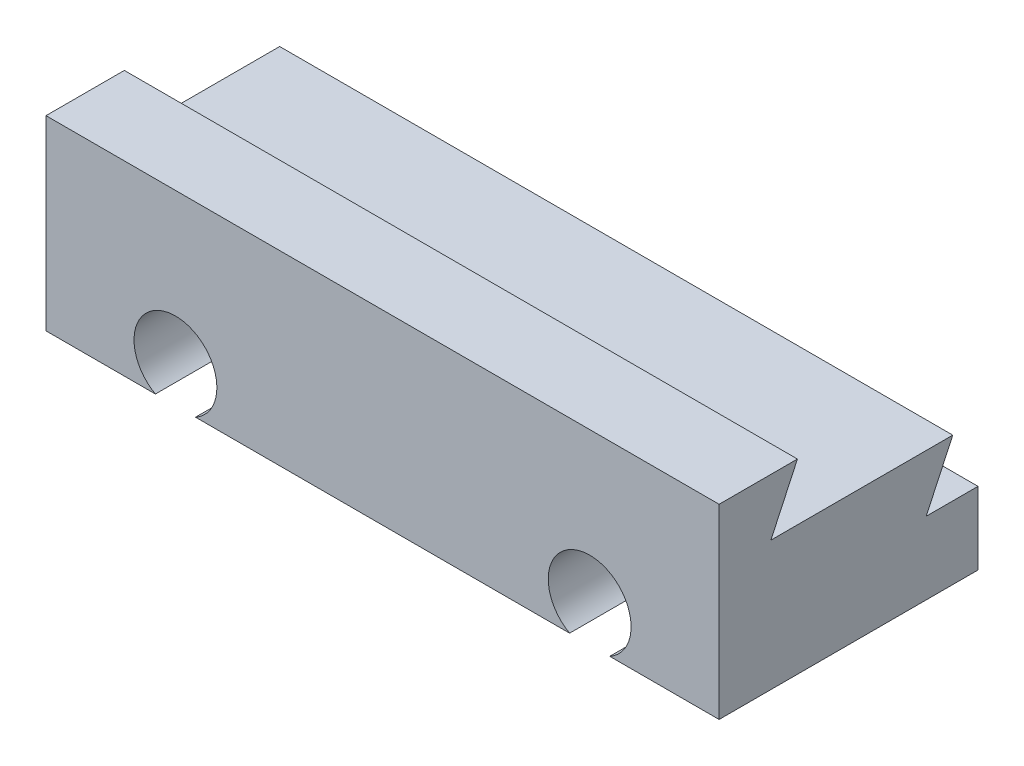
ISO-10303-21;
HEADER;
FILE_DESCRIPTION(('STEP AP214'),'2;1');
FILE_NAME('part.step','',(''),(''),'','','');
FILE_SCHEMA(('AUTOMOTIVE_DESIGN { 1 0 10303 214 1 1 1 1 }'));
ENDSEC;
DATA;
#1=APPLICATION_CONTEXT('core data for automotive mechanical design processes');
#2=APPLICATION_PROTOCOL_DEFINITION('international standard','automotive_design',2000,#1);
#3=PRODUCT_CONTEXT('',#1,'mechanical');
#4=PRODUCT('Part','Part','',(#3));
#5=PRODUCT_RELATED_PRODUCT_CATEGORY('part','',(#4));
#6=PRODUCT_DEFINITION_FORMATION('','',#4);
#7=PRODUCT_DEFINITION_CONTEXT('part definition',#1,'design');
#8=PRODUCT_DEFINITION('design','',#6,#7);
#9=PRODUCT_DEFINITION_SHAPE('','',#8);
#10=(LENGTH_UNIT() NAMED_UNIT(*) SI_UNIT(.MILLI.,.METRE.));
#11=(NAMED_UNIT(*) PLANE_ANGLE_UNIT() SI_UNIT($,.RADIAN.));
#12=(NAMED_UNIT(*) SI_UNIT($,.STERADIAN.) SOLID_ANGLE_UNIT());
#13=UNCERTAINTY_MEASURE_WITH_UNIT(LENGTH_MEASURE(1.E-05),#10,'distance_accuracy_value','');
#14=(GEOMETRIC_REPRESENTATION_CONTEXT(3) GLOBAL_UNCERTAINTY_ASSIGNED_CONTEXT((#13)) GLOBAL_UNIT_ASSIGNED_CONTEXT((#10,
#11,#12)) REPRESENTATION_CONTEXT('',''));
#15=CARTESIAN_POINT('',(0.,0.,0.));
#16=DIRECTION('',(0.,0.,1.));
#17=DIRECTION('',(1.,0.,0.));
#18=AXIS2_PLACEMENT_3D('',#15,#16,#17);
#19=CARTESIAN_POINT('',(52.5,3.5,5.939696961967));
#20=DIRECTION('',(0.,0.,-1.));
#21=DIRECTION('',(-1.,0.,0.));
#22=AXIS2_PLACEMENT_3D('',#19,#20,#21);
#23=CYLINDRICAL_SURFACE('',#22,2.1);
#24=CARTESIAN_POINT('',(52.5,3.5,-25.));
#25=DIRECTION('',(0.,0.,-1.));
#26=DIRECTION('',(1.,0.,0.));
#27=AXIS2_PLACEMENT_3D('',#24,#25,#26);
#28=CIRCLE('',#27,2.1);
#29=CARTESIAN_POINT('',(54.6,3.5,-25.));
#30=VERTEX_POINT('',#29);
#31=EDGE_CURVE('E144',#30,#30,#28,.T.);
#32=ORIENTED_EDGE('',*,*,#31,.T.);
#33=EDGE_LOOP('',(#32));
#34=FACE_BOUND('',#33,.T.);
#35=CARTESIAN_POINT('',(52.5,3.5,-15.));
#36=DIRECTION('',(0.,0.,1.));
#37=DIRECTION('',(1.,0.,0.));
#38=AXIS2_PLACEMENT_3D('',#35,#36,#37);
#39=CIRCLE('',#38,2.1);
#40=CARTESIAN_POINT('',(54.6,3.5,-15.));
#41=VERTEX_POINT('',#40);
#42=EDGE_CURVE('E38',#41,#41,#39,.F.);
#43=ORIENTED_EDGE('',*,*,#42,.F.);
#44=EDGE_LOOP('',(#43));
#45=FACE_BOUND('',#44,.T.);
#46=ADVANCED_FACE('F34',(#34,#45),#23,.F.);
#47=CARTESIAN_POINT('',(12.5,3.5,5.939696961967));
#48=DIRECTION('',(0.,0.,-1.));
#49=DIRECTION('',(-1.,0.,0.));
#50=AXIS2_PLACEMENT_3D('',#47,#48,#49);
#51=CYLINDRICAL_SURFACE('',#50,2.1);
#52=CARTESIAN_POINT('',(12.5,3.5,-25.));
#53=DIRECTION('',(0.,0.,-1.));
#54=DIRECTION('',(-1.,0.,0.));
#55=AXIS2_PLACEMENT_3D('',#52,#53,#54);
#56=CIRCLE('',#55,2.1);
#57=CARTESIAN_POINT('',(10.4,3.5,-25.));
#58=VERTEX_POINT('',#57);
#59=EDGE_CURVE('E149',#58,#58,#56,.T.);
#60=ORIENTED_EDGE('',*,*,#59,.T.);
#61=EDGE_LOOP('',(#60));
#62=FACE_BOUND('',#61,.T.);
#63=CARTESIAN_POINT('',(12.5,3.5,-15.));
#64=DIRECTION('',(0.,0.,1.));
#65=DIRECTION('',(1.,0.,0.));
#66=AXIS2_PLACEMENT_3D('',#63,#64,#65);
#67=CIRCLE('',#66,2.1);
#68=CARTESIAN_POINT('',(14.6,3.5,-15.));
#69=VERTEX_POINT('',#68);
#70=EDGE_CURVE('E132',#69,#69,#67,.F.);
#71=ORIENTED_EDGE('',*,*,#70,.F.);
#72=EDGE_LOOP('',(#71));
#73=FACE_BOUND('',#72,.T.);
#74=ADVANCED_FACE('F213',(#62,#73),#51,.F.);
#75=CARTESIAN_POINT('',(65.,0.,-25.));
#76=DIRECTION('',(0.,1.,0.));
#77=DIRECTION('',(0.,0.,1.));
#78=AXIS2_PLACEMENT_3D('',#75,#76,#77);
#79=PLANE('',#78);
#80=DIRECTION('',(1.,0.,0.));
#81=VECTOR('',#80,1.);
#82=CARTESIAN_POINT('',(65.,0.,-15.));
#83=LINE('',#82,#81);
#84=CARTESIAN_POINT('',(10.5635083268963,0.,-15.));
#85=VERTEX_POINT('',#84);
#86=CARTESIAN_POINT('',(14.4364916731037,0.,-15.));
#87=VERTEX_POINT('',#86);
#88=EDGE_CURVE('E127',#85,#87,#83,.T.);
#89=ORIENTED_EDGE('',*,*,#88,.F.);
#90=DIRECTION('',(0.,0.,1.));
#91=VECTOR('',#90,1.);
#92=CARTESIAN_POINT('',(10.5635083268963,0.,-36.3137084989848));
#93=LINE('',#92,#91);
#94=CARTESIAN_POINT('',(10.5635083268963,0.,0.));
#95=VERTEX_POINT('',#94);
#96=EDGE_CURVE('E135',#85,#95,#93,.T.);
#97=ORIENTED_EDGE('',*,*,#96,.T.);
#98=DIRECTION('',(-1.,0.,0.));
#99=VECTOR('',#98,1.);
#100=CARTESIAN_POINT('',(65.,0.,0.));
#101=LINE('',#100,#99);
#102=CARTESIAN_POINT('',(0.,0.,0.));
#103=VERTEX_POINT('',#102);
#104=EDGE_CURVE('E173',#95,#103,#101,.T.);
#105=ORIENTED_EDGE('',*,*,#104,.T.);
#106=DIRECTION('',(0.,0.,-1.));
#107=VECTOR('',#106,1.);
#108=CARTESIAN_POINT('',(0.,0.,-25.));
#109=LINE('',#108,#107);
#110=CARTESIAN_POINT('',(0.,0.,-25.));
#111=VERTEX_POINT('',#110);
#112=EDGE_CURVE('E152',#103,#111,#109,.T.);
#113=ORIENTED_EDGE('',*,*,#112,.T.);
#114=DIRECTION('',(-1.,0.,0.));
#115=VECTOR('',#114,1.);
#116=CARTESIAN_POINT('',(65.,0.,-25.));
#117=LINE('',#116,#115);
#118=CARTESIAN_POINT('',(65.,0.,-25.));
#119=VERTEX_POINT('',#118);
#120=EDGE_CURVE('E12',#119,#111,#117,.T.);
#121=ORIENTED_EDGE('',*,*,#120,.F.);
#122=DIRECTION('',(0.,0.,-1.));
#123=VECTOR('',#122,1.);
#124=CARTESIAN_POINT('',(65.,0.,-25.));
#125=LINE('',#124,#123);
#126=CARTESIAN_POINT('',(65.,0.,0.));
#127=VERTEX_POINT('',#126);
#128=EDGE_CURVE('E155',#127,#119,#125,.T.);
#129=ORIENTED_EDGE('',*,*,#128,.F.);
#130=CARTESIAN_POINT('',(54.4364916731037,0.,0.));
#131=VERTEX_POINT('',#130);
#132=EDGE_CURVE('E190',#127,#131,#101,.T.);
#133=ORIENTED_EDGE('',*,*,#132,.T.);
#134=DIRECTION('',(0.,0.,1.));
#135=VECTOR('',#134,1.);
#136=CARTESIAN_POINT('',(54.4364916731037,0.,-36.3137084989848));
#137=LINE('',#136,#135);
#138=CARTESIAN_POINT('',(54.4364916731037,0.,-15.));
#139=VERTEX_POINT('',#138);
#140=EDGE_CURVE('E59',#131,#139,#137,.F.);
#141=ORIENTED_EDGE('',*,*,#140,.T.);
#142=DIRECTION('',(1.,0.,0.));
#143=VECTOR('',#142,1.);
#144=CARTESIAN_POINT('',(65.,0.,-15.));
#145=LINE('',#144,#143);
#146=CARTESIAN_POINT('',(50.5635083268963,0.,-15.));
#147=VERTEX_POINT('',#146);
#148=EDGE_CURVE('E292',#147,#139,#145,.T.);
#149=ORIENTED_EDGE('',*,*,#148,.F.);
#150=DIRECTION('',(0.,0.,1.));
#151=VECTOR('',#150,1.);
#152=CARTESIAN_POINT('',(50.5635083268963,0.,-36.3137084989848));
#153=LINE('',#152,#151);
#154=CARTESIAN_POINT('',(50.5635083268963,0.,0.));
#155=VERTEX_POINT('',#154);
#156=EDGE_CURVE('E142',#147,#155,#153,.T.);
#157=ORIENTED_EDGE('',*,*,#156,.T.);
#158=CARTESIAN_POINT('',(14.4364916731037,0.,0.));
#159=VERTEX_POINT('',#158);
#160=EDGE_CURVE('E141',#155,#159,#101,.T.);
#161=ORIENTED_EDGE('',*,*,#160,.T.);
#162=DIRECTION('',(0.,0.,1.));
#163=VECTOR('',#162,1.);
#164=CARTESIAN_POINT('',(14.4364916731037,0.,-36.3137084989848));
#165=LINE('',#164,#163);
#166=EDGE_CURVE('E51',#159,#87,#165,.F.);
#167=ORIENTED_EDGE('',*,*,#166,.T.);
#168=EDGE_LOOP('',(#89,#97,#105,#113,#121,#129,#133,#141,#149,#157,#161,#167));
#169=FACE_BOUND('',#168,.T.);
#170=ADVANCED_FACE('F36',(#169),#79,.F.);
#171=CARTESIAN_POINT('',(65.,7.,-25.));
#172=DIRECTION('',(0.,0.,1.));
#173=DIRECTION('',(1.,0.,0.));
#174=AXIS2_PLACEMENT_3D('',#171,#172,#173);
#175=PLANE('',#174);
#176=ORIENTED_EDGE('',*,*,#59,.F.);
#177=EDGE_LOOP('',(#176));
#178=FACE_BOUND('',#177,.T.);
#179=ORIENTED_EDGE('',*,*,#31,.F.);
#180=EDGE_LOOP('',(#179));
#181=FACE_BOUND('',#180,.T.);
#182=DIRECTION('',(0.,1.,0.));
#183=VECTOR('',#182,1.);
#184=CARTESIAN_POINT('',(0.,7.,-25.));
#185=LINE('',#184,#183);
#186=CARTESIAN_POINT('',(0.,7.,-25.));
#187=VERTEX_POINT('',#186);
#188=EDGE_CURVE('E176',#111,#187,#185,.T.);
#189=ORIENTED_EDGE('',*,*,#188,.T.);
#190=DIRECTION('',(-1.,0.,0.));
#191=VECTOR('',#190,1.);
#192=CARTESIAN_POINT('',(65.,7.,-25.));
#193=LINE('',#192,#191);
#194=CARTESIAN_POINT('',(65.,7.,-25.));
#195=VERTEX_POINT('',#194);
#196=EDGE_CURVE('E43',#195,#187,#193,.T.);
#197=ORIENTED_EDGE('',*,*,#196,.F.);
#198=DIRECTION('',(0.,1.,0.));
#199=VECTOR('',#198,1.);
#200=CARTESIAN_POINT('',(65.,7.,-25.));
#201=LINE('',#200,#199);
#202=EDGE_CURVE('E158',#119,#195,#201,.T.);
#203=ORIENTED_EDGE('',*,*,#202,.F.);
#204=ORIENTED_EDGE('',*,*,#120,.T.);
#205=EDGE_LOOP('',(#189,#197,#203,#204));
#206=FACE_BOUND('',#205,.T.);
#207=ADVANCED_FACE('F221',(#178,#181,#206),#175,.F.);
#208=CARTESIAN_POINT('',(65.,7.,-20.));
#209=DIRECTION('',(0.,-1.,0.));
#210=DIRECTION('',(0.,0.,-1.));
#211=AXIS2_PLACEMENT_3D('',#208,#209,#210);
#212=PLANE('',#211);
#213=DIRECTION('',(0.,0.,1.));
#214=VECTOR('',#213,1.);
#215=CARTESIAN_POINT('',(0.,7.,-20.));
#216=LINE('',#215,#214);
#217=CARTESIAN_POINT('',(0.,7.,-20.));
#218=VERTEX_POINT('',#217);
#219=EDGE_CURVE('E178',#187,#218,#216,.T.);
#220=ORIENTED_EDGE('',*,*,#219,.T.);
#221=DIRECTION('',(-1.,0.,0.));
#222=VECTOR('',#221,1.);
#223=CARTESIAN_POINT('',(65.,7.,-20.));
#224=LINE('',#223,#222);
#225=CARTESIAN_POINT('',(65.,7.,-20.));
#226=VERTEX_POINT('',#225);
#227=EDGE_CURVE('E205',#226,#218,#224,.T.);
#228=ORIENTED_EDGE('',*,*,#227,.F.);
#229=DIRECTION('',(0.,0.,1.));
#230=VECTOR('',#229,1.);
#231=CARTESIAN_POINT('',(65.,7.,-20.));
#232=LINE('',#231,#230);
#233=EDGE_CURVE('E161',#195,#226,#232,.T.);
#234=ORIENTED_EDGE('',*,*,#233,.F.);
#235=ORIENTED_EDGE('',*,*,#196,.T.);
#236=EDGE_LOOP('',(#220,#228,#234,#235));
#237=FACE_BOUND('',#236,.T.);
#238=ADVANCED_FACE('F255',(#237),#212,.F.);
#239=CARTESIAN_POINT('',(65.,12.5,-22.5646921198525));
#240=DIRECTION('',(0.,0.422618261740704,0.906307787036648));
#241=DIRECTION('',(0.,-0.906307787036648,0.422618261740704));
#242=AXIS2_PLACEMENT_3D('',#239,#240,#241);
#243=PLANE('',#242);
#244=DIRECTION('',(0.,0.906307787036648,-0.422618261740704));
#245=VECTOR('',#244,1.);
#246=CARTESIAN_POINT('',(0.,12.5,-22.5646921198525));
#247=LINE('',#246,#245);
#248=CARTESIAN_POINT('',(0.,12.5,-22.5646921198525));
#249=VERTEX_POINT('',#248);
#250=EDGE_CURVE('E180',#218,#249,#247,.T.);
#251=ORIENTED_EDGE('',*,*,#250,.T.);
#252=DIRECTION('',(-1.,0.,0.));
#253=VECTOR('',#252,1.);
#254=CARTESIAN_POINT('',(65.,12.5,-22.5646921198525));
#255=LINE('',#254,#253);
#256=CARTESIAN_POINT('',(65.,12.5,-22.5646921198525));
#257=VERTEX_POINT('',#256);
#258=EDGE_CURVE('E202',#257,#249,#255,.T.);
#259=ORIENTED_EDGE('',*,*,#258,.F.);
#260=DIRECTION('',(0.,0.906307787036648,-0.422618261740704));
#261=VECTOR('',#260,1.);
#262=CARTESIAN_POINT('',(65.,12.5,-22.5646921198525));
#263=LINE('',#262,#261);
#264=EDGE_CURVE('E163',#226,#257,#263,.T.);
#265=ORIENTED_EDGE('',*,*,#264,.F.);
#266=ORIENTED_EDGE('',*,*,#227,.T.);
#267=EDGE_LOOP('',(#251,#259,#265,#266));
#268=FACE_BOUND('',#267,.T.);
#269=ADVANCED_FACE('F251',(#268),#243,.F.);
#270=CARTESIAN_POINT('',(65.,12.5,-5.));
#271=DIRECTION('',(0.,-1.,0.));
#272=DIRECTION('',(0.,0.,-1.));
#273=AXIS2_PLACEMENT_3D('',#270,#271,#272);
#274=PLANE('',#273);
#275=DIRECTION('',(0.,0.,1.));
#276=VECTOR('',#275,1.);
#277=CARTESIAN_POINT('',(0.,12.5,-5.));
#278=LINE('',#277,#276);
#279=CARTESIAN_POINT('',(0.,12.5,-5.));
#280=VERTEX_POINT('',#279);
#281=EDGE_CURVE('E182',#249,#280,#278,.T.);
#282=ORIENTED_EDGE('',*,*,#281,.T.);
#283=DIRECTION('',(-1.,0.,0.));
#284=VECTOR('',#283,1.);
#285=CARTESIAN_POINT('',(65.,12.5,-5.));
#286=LINE('',#285,#284);
#287=CARTESIAN_POINT('',(65.,12.5,-5.));
#288=VERTEX_POINT('',#287);
#289=EDGE_CURVE('E199',#288,#280,#286,.T.);
#290=ORIENTED_EDGE('',*,*,#289,.F.);
#291=DIRECTION('',(0.,0.,1.));
#292=VECTOR('',#291,1.);
#293=CARTESIAN_POINT('',(65.,12.5,-5.));
#294=LINE('',#293,#292);
#295=EDGE_CURVE('E165',#257,#288,#294,.T.);
#296=ORIENTED_EDGE('',*,*,#295,.F.);
#297=ORIENTED_EDGE('',*,*,#258,.T.);
#298=EDGE_LOOP('',(#282,#290,#296,#297));
#299=FACE_BOUND('',#298,.T.);
#300=ADVANCED_FACE('F247',(#299),#274,.F.);
#301=CARTESIAN_POINT('',(65.,18.,-7.56469211985252));
#302=DIRECTION('',(0.,0.422618261740704,0.906307787036648));
#303=DIRECTION('',(0.,-0.906307787036648,0.422618261740704));
#304=AXIS2_PLACEMENT_3D('',#301,#302,#303);
#305=PLANE('',#304);
#306=DIRECTION('',(0.,0.906307787036648,-0.422618261740704));
#307=VECTOR('',#306,1.);
#308=CARTESIAN_POINT('',(0.,18.,-7.56469211985252));
#309=LINE('',#308,#307);
#310=CARTESIAN_POINT('',(0.,18.,-7.56469211985252));
#311=VERTEX_POINT('',#310);
#312=EDGE_CURVE('E184',#280,#311,#309,.T.);
#313=ORIENTED_EDGE('',*,*,#312,.T.);
#314=DIRECTION('',(-1.,0.,0.));
#315=VECTOR('',#314,1.);
#316=CARTESIAN_POINT('',(65.,18.,-7.56469211985252));
#317=LINE('',#316,#315);
#318=CARTESIAN_POINT('',(65.,18.,-7.56469211985252));
#319=VERTEX_POINT('',#318);
#320=EDGE_CURVE('E196',#319,#311,#317,.T.);
#321=ORIENTED_EDGE('',*,*,#320,.F.);
#322=DIRECTION('',(0.,0.906307787036648,-0.422618261740704));
#323=VECTOR('',#322,1.);
#324=CARTESIAN_POINT('',(65.,18.,-7.56469211985252));
#325=LINE('',#324,#323);
#326=EDGE_CURVE('E167',#288,#319,#325,.T.);
#327=ORIENTED_EDGE('',*,*,#326,.F.);
#328=ORIENTED_EDGE('',*,*,#289,.T.);
#329=EDGE_LOOP('',(#313,#321,#327,#328));
#330=FACE_BOUND('',#329,.T.);
#331=ADVANCED_FACE('F243',(#330),#305,.F.);
#332=CARTESIAN_POINT('',(65.,18.,0.));
#333=DIRECTION('',(0.,-1.,0.));
#334=DIRECTION('',(0.,0.,-1.));
#335=AXIS2_PLACEMENT_3D('',#332,#333,#334);
#336=PLANE('',#335);
#337=DIRECTION('',(0.,0.,1.));
#338=VECTOR('',#337,1.);
#339=CARTESIAN_POINT('',(0.,18.,0.));
#340=LINE('',#339,#338);
#341=CARTESIAN_POINT('',(0.,18.,0.));
#342=VERTEX_POINT('',#341);
#343=EDGE_CURVE('E186',#311,#342,#340,.T.);
#344=ORIENTED_EDGE('',*,*,#343,.T.);
#345=DIRECTION('',(-1.,0.,0.));
#346=VECTOR('',#345,1.);
#347=CARTESIAN_POINT('',(65.,18.,0.));
#348=LINE('',#347,#346);
#349=CARTESIAN_POINT('',(65.,18.,0.));
#350=VERTEX_POINT('',#349);
#351=EDGE_CURVE('E193',#350,#342,#348,.T.);
#352=ORIENTED_EDGE('',*,*,#351,.F.);
#353=DIRECTION('',(0.,0.,1.));
#354=VECTOR('',#353,1.);
#355=CARTESIAN_POINT('',(65.,18.,0.));
#356=LINE('',#355,#354);
#357=EDGE_CURVE('E169',#319,#350,#356,.T.);
#358=ORIENTED_EDGE('',*,*,#357,.F.);
#359=ORIENTED_EDGE('',*,*,#320,.T.);
#360=EDGE_LOOP('',(#344,#352,#358,#359));
#361=FACE_BOUND('',#360,.T.);
#362=ADVANCED_FACE('F239',(#361),#336,.F.);
#363=CARTESIAN_POINT('',(65.,0.,0.));
#364=DIRECTION('',(0.,0.,-1.));
#365=DIRECTION('',(-1.,0.,0.));
#366=AXIS2_PLACEMENT_3D('',#363,#364,#365);
#367=PLANE('',#366);
#368=ORIENTED_EDGE('',*,*,#104,.F.);
#369=CARTESIAN_POINT('',(12.5,3.5,0.));
#370=DIRECTION('',(0.,0.,1.));
#371=DIRECTION('',(1.,0.,0.));
#372=AXIS2_PLACEMENT_3D('',#369,#370,#371);
#373=CIRCLE('',#372,4.);
#374=EDGE_CURVE('E136',#159,#95,#373,.T.);
#375=ORIENTED_EDGE('',*,*,#374,.F.);
#376=ORIENTED_EDGE('',*,*,#160,.F.);
#377=CARTESIAN_POINT('',(52.5,3.5,0.));
#378=DIRECTION('',(0.,0.,1.));
#379=DIRECTION('',(1.,0.,0.));
#380=AXIS2_PLACEMENT_3D('',#377,#378,#379);
#381=CIRCLE('',#380,4.00000000000001);
#382=EDGE_CURVE('E290',#131,#155,#381,.T.);
#383=ORIENTED_EDGE('',*,*,#382,.F.);
#384=ORIENTED_EDGE('',*,*,#132,.F.);
#385=DIRECTION('',(0.,-1.,0.));
#386=VECTOR('',#385,1.);
#387=CARTESIAN_POINT('',(65.,0.,0.));
#388=LINE('',#387,#386);
#389=EDGE_CURVE('E171',#350,#127,#388,.T.);
#390=ORIENTED_EDGE('',*,*,#389,.F.);
#391=ORIENTED_EDGE('',*,*,#351,.T.);
#392=DIRECTION('',(0.,-1.,0.));
#393=VECTOR('',#392,1.);
#394=CARTESIAN_POINT('',(0.,0.,0.));
#395=LINE('',#394,#393);
#396=EDGE_CURVE('E159',#342,#103,#395,.T.);
#397=ORIENTED_EDGE('',*,*,#396,.T.);
#398=EDGE_LOOP('',(#368,#375,#376,#383,#384,#390,#391,#397));
#399=FACE_BOUND('',#398,.T.);
#400=ADVANCED_FACE('F232',(#399),#367,.F.);
#401=CARTESIAN_POINT('',(65.,0.,0.));
#402=DIRECTION('',(-1.,0.,0.));
#403=DIRECTION('',(0.,0.,1.));
#404=AXIS2_PLACEMENT_3D('',#401,#402,#403);
#405=PLANE('',#404);
#406=ORIENTED_EDGE('',*,*,#128,.T.);
#407=ORIENTED_EDGE('',*,*,#202,.T.);
#408=ORIENTED_EDGE('',*,*,#233,.T.);
#409=ORIENTED_EDGE('',*,*,#264,.T.);
#410=ORIENTED_EDGE('',*,*,#295,.T.);
#411=ORIENTED_EDGE('',*,*,#326,.T.);
#412=ORIENTED_EDGE('',*,*,#357,.T.);
#413=ORIENTED_EDGE('',*,*,#389,.T.);
#414=EDGE_LOOP('',(#406,#407,#408,#409,#410,#411,#412,#413));
#415=FACE_BOUND('',#414,.T.);
#416=ADVANCED_FACE('F228',(#415),#405,.F.);
#417=CARTESIAN_POINT('',(0.,0.,0.));
#418=DIRECTION('',(-1.,0.,0.));
#419=DIRECTION('',(0.,0.,1.));
#420=AXIS2_PLACEMENT_3D('',#417,#418,#419);
#421=PLANE('',#420);
#422=ORIENTED_EDGE('',*,*,#112,.F.);
#423=ORIENTED_EDGE('',*,*,#396,.F.);
#424=ORIENTED_EDGE('',*,*,#343,.F.);
#425=ORIENTED_EDGE('',*,*,#312,.F.);
#426=ORIENTED_EDGE('',*,*,#281,.F.);
#427=ORIENTED_EDGE('',*,*,#250,.F.);
#428=ORIENTED_EDGE('',*,*,#219,.F.);
#429=ORIENTED_EDGE('',*,*,#188,.F.);
#430=EDGE_LOOP('',(#422,#423,#424,#425,#426,#427,#428,#429));
#431=FACE_BOUND('',#430,.T.);
#432=ADVANCED_FACE('F231',(#431),#421,.T.);
#433=CARTESIAN_POINT('',(12.5,3.5,-36.3137084989848));
#434=DIRECTION('',(0.,0.,1.));
#435=DIRECTION('',(1.,0.,0.));
#436=AXIS2_PLACEMENT_3D('',#433,#434,#435);
#437=CYLINDRICAL_SURFACE('',#436,4.);
#438=CARTESIAN_POINT('',(12.5,3.5,-15.));
#439=DIRECTION('',(0.,0.,1.));
#440=DIRECTION('',(1.,0.,0.));
#441=AXIS2_PLACEMENT_3D('',#438,#439,#440);
#442=CIRCLE('',#441,4.);
#443=EDGE_CURVE('E129',#85,#87,#442,.F.);
#444=ORIENTED_EDGE('',*,*,#443,.T.);
#445=ORIENTED_EDGE('',*,*,#166,.F.);
#446=ORIENTED_EDGE('',*,*,#374,.T.);
#447=ORIENTED_EDGE('',*,*,#96,.F.);
#448=EDGE_LOOP('',(#444,#445,#446,#447));
#449=FACE_BOUND('',#448,.T.);
#450=ADVANCED_FACE('F134',(#449),#437,.F.);
#451=CARTESIAN_POINT('',(65.,7.,-15.));
#452=DIRECTION('',(0.,0.,1.));
#453=DIRECTION('',(1.,0.,0.));
#454=AXIS2_PLACEMENT_3D('',#451,#452,#453);
#455=PLANE('',#454);
#456=ORIENTED_EDGE('',*,*,#70,.T.);
#457=EDGE_LOOP('',(#456));
#458=FACE_BOUND('',#457,.T.);
#459=ORIENTED_EDGE('',*,*,#88,.T.);
#460=ORIENTED_EDGE('',*,*,#443,.F.);
#461=EDGE_LOOP('',(#459,#460));
#462=FACE_BOUND('',#461,.T.);
#463=ADVANCED_FACE('F128',(#458,#462),#455,.T.);
#464=CARTESIAN_POINT('',(52.5,3.5,-36.3137084989848));
#465=DIRECTION('',(0.,0.,1.));
#466=DIRECTION('',(1.,0.,0.));
#467=AXIS2_PLACEMENT_3D('',#464,#465,#466);
#468=CYLINDRICAL_SURFACE('',#467,4.00000000000001);
#469=CARTESIAN_POINT('',(52.5,3.5,-15.));
#470=DIRECTION('',(0.,0.,1.));
#471=DIRECTION('',(1.,0.,0.));
#472=AXIS2_PLACEMENT_3D('',#469,#470,#471);
#473=CIRCLE('',#472,4.00000000000001);
#474=EDGE_CURVE('E295',#147,#139,#473,.F.);
#475=ORIENTED_EDGE('',*,*,#474,.T.);
#476=ORIENTED_EDGE('',*,*,#140,.F.);
#477=ORIENTED_EDGE('',*,*,#382,.T.);
#478=ORIENTED_EDGE('',*,*,#156,.F.);
#479=EDGE_LOOP('',(#475,#476,#477,#478));
#480=FACE_BOUND('',#479,.T.);
#481=ADVANCED_FACE('F225',(#480),#468,.F.);
#482=CARTESIAN_POINT('',(65.,7.,-15.));
#483=DIRECTION('',(0.,0.,1.));
#484=DIRECTION('',(1.,0.,0.));
#485=AXIS2_PLACEMENT_3D('',#482,#483,#484);
#486=PLANE('',#485);
#487=ORIENTED_EDGE('',*,*,#42,.T.);
#488=EDGE_LOOP('',(#487));
#489=FACE_BOUND('',#488,.T.);
#490=ORIENTED_EDGE('',*,*,#148,.T.);
#491=ORIENTED_EDGE('',*,*,#474,.F.);
#492=EDGE_LOOP('',(#490,#491));
#493=FACE_BOUND('',#492,.T.);
#494=ADVANCED_FACE('F300',(#489,#493),#486,.T.);
#495=CLOSED_SHELL('',(#46,#74,#170,#207,#238,#269,#300,#331,#362,#400,#416,#432,#450,#463,#481,#494));
#496=MANIFOLD_SOLID_BREP('B2',#495);
#497=ADVANCED_BREP_SHAPE_REPRESENTATION('',(#18,#496),#14);
#498=SHAPE_DEFINITION_REPRESENTATION(#9,#497);
ENDSEC;
END-ISO-10303-21;
